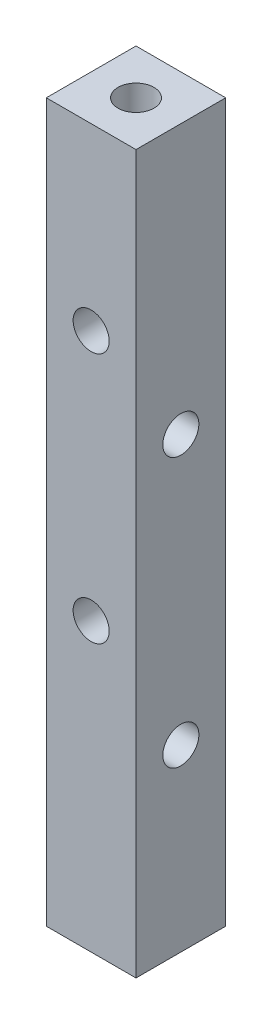
ISO-10303-21;
HEADER;
FILE_DESCRIPTION(('STEP AP214'),'2;1');
FILE_NAME('part.step','',(''),(''),'','','');
FILE_SCHEMA(('AUTOMOTIVE_DESIGN { 1 0 10303 214 1 1 1 1 }'));
ENDSEC;
DATA;
#1=APPLICATION_CONTEXT('core data for automotive mechanical design processes');
#2=APPLICATION_PROTOCOL_DEFINITION('international standard','automotive_design',2000,#1);
#3=PRODUCT_CONTEXT('',#1,'mechanical');
#4=PRODUCT('Part','Part','',(#3));
#5=PRODUCT_RELATED_PRODUCT_CATEGORY('part','',(#4));
#6=PRODUCT_DEFINITION_FORMATION('','',#4);
#7=PRODUCT_DEFINITION_CONTEXT('part definition',#1,'design');
#8=PRODUCT_DEFINITION('design','',#6,#7);
#9=PRODUCT_DEFINITION_SHAPE('','',#8);
#10=(LENGTH_UNIT() NAMED_UNIT(*) SI_UNIT(.MILLI.,.METRE.));
#11=(NAMED_UNIT(*) PLANE_ANGLE_UNIT() SI_UNIT($,.RADIAN.));
#12=(NAMED_UNIT(*) SI_UNIT($,.STERADIAN.) SOLID_ANGLE_UNIT());
#13=UNCERTAINTY_MEASURE_WITH_UNIT(LENGTH_MEASURE(1.E-05),#10,'distance_accuracy_value','');
#14=(GEOMETRIC_REPRESENTATION_CONTEXT(3) GLOBAL_UNCERTAINTY_ASSIGNED_CONTEXT((#13)) GLOBAL_UNIT_ASSIGNED_CONTEXT((#10,
#11,#12)) REPRESENTATION_CONTEXT('',''));
#15=CARTESIAN_POINT('',(0.,0.,0.));
#16=DIRECTION('',(0.,0.,1.));
#17=DIRECTION('',(1.,0.,0.));
#18=AXIS2_PLACEMENT_3D('',#15,#16,#17);
#19=CARTESIAN_POINT('',(0.,101.6,0.));
#20=DIRECTION('',(1.,0.,0.));
#21=DIRECTION('',(0.,0.,-1.));
#22=AXIS2_PLACEMENT_3D('',#19,#20,#21);
#23=PLANE('',#22);
#24=CARTESIAN_POINT('',(0.,25.4,6.35));
#25=DIRECTION('',(1.,0.,0.));
#26=DIRECTION('',(0.,0.,-1.));
#27=AXIS2_PLACEMENT_3D('',#24,#25,#26);
#28=CIRCLE('',#27,2.55269999999999);
#29=CARTESIAN_POINT('',(0.,25.4,3.79730000000002));
#30=VERTEX_POINT('',#29);
#31=EDGE_CURVE('E164',#30,#30,#28,.T.);
#32=ORIENTED_EDGE('',*,*,#31,.T.);
#33=EDGE_LOOP('',(#32));
#34=FACE_BOUND('',#33,.T.);
#35=CARTESIAN_POINT('',(0.,63.5,6.35));
#36=DIRECTION('',(1.,0.,0.));
#37=DIRECTION('',(0.,0.,-1.));
#38=AXIS2_PLACEMENT_3D('',#35,#36,#37);
#39=CIRCLE('',#38,2.55269999999999);
#40=CARTESIAN_POINT('',(0.,63.5,3.79730000000001));
#41=VERTEX_POINT('',#40);
#42=EDGE_CURVE('E167',#41,#41,#39,.T.);
#43=ORIENTED_EDGE('',*,*,#42,.T.);
#44=EDGE_LOOP('',(#43));
#45=FACE_BOUND('',#44,.T.);
#46=DIRECTION('',(0.,0.,1.));
#47=VECTOR('',#46,1.);
#48=CARTESIAN_POINT('',(0.,0.,0.));
#49=LINE('',#48,#47);
#50=CARTESIAN_POINT('',(0.,0.,0.));
#51=VERTEX_POINT('',#50);
#52=CARTESIAN_POINT('',(0.,0.,12.7));
#53=VERTEX_POINT('',#52);
#54=EDGE_CURVE('E114',#51,#53,#49,.T.);
#55=ORIENTED_EDGE('',*,*,#54,.T.);
#56=DIRECTION('',(0.,-1.,0.));
#57=VECTOR('',#56,1.);
#58=CARTESIAN_POINT('',(0.,101.6,12.7));
#59=LINE('',#58,#57);
#60=CARTESIAN_POINT('',(0.,101.6,12.7));
#61=VERTEX_POINT('',#60);
#62=EDGE_CURVE('E11',#61,#53,#59,.T.);
#63=ORIENTED_EDGE('',*,*,#62,.F.);
#64=DIRECTION('',(0.,0.,1.));
#65=VECTOR('',#64,1.);
#66=CARTESIAN_POINT('',(0.,101.6,0.));
#67=LINE('',#66,#65);
#68=CARTESIAN_POINT('',(0.,101.6,0.));
#69=VERTEX_POINT('',#68);
#70=EDGE_CURVE('E115',#69,#61,#67,.T.);
#71=ORIENTED_EDGE('',*,*,#70,.F.);
#72=DIRECTION('',(0.,-1.,0.));
#73=VECTOR('',#72,1.);
#74=CARTESIAN_POINT('',(0.,101.6,0.));
#75=LINE('',#74,#73);
#76=EDGE_CURVE('E121',#69,#51,#75,.T.);
#77=ORIENTED_EDGE('',*,*,#76,.T.);
#78=EDGE_LOOP('',(#55,#63,#71,#77));
#79=FACE_BOUND('',#78,.T.);
#80=ADVANCED_FACE('F37',(#34,#45,#79),#23,.F.);
#81=CARTESIAN_POINT('',(0.,101.6,12.7));
#82=DIRECTION('',(0.,0.,-1.));
#83=DIRECTION('',(-1.,0.,0.));
#84=AXIS2_PLACEMENT_3D('',#81,#82,#83);
#85=PLANE('',#84);
#86=CARTESIAN_POINT('',(6.35,76.2,12.7));
#87=DIRECTION('',(0.,0.,-1.));
#88=DIRECTION('',(-1.,0.,0.));
#89=AXIS2_PLACEMENT_3D('',#86,#87,#88);
#90=CIRCLE('',#89,2.55269999999999);
#91=CARTESIAN_POINT('',(3.79730000000001,76.2,12.7));
#92=VERTEX_POINT('',#91);
#93=EDGE_CURVE('E173',#92,#92,#90,.T.);
#94=ORIENTED_EDGE('',*,*,#93,.T.);
#95=EDGE_LOOP('',(#94));
#96=FACE_BOUND('',#95,.T.);
#97=CARTESIAN_POINT('',(6.35,40.64,12.7));
#98=DIRECTION('',(0.,0.,-1.));
#99=DIRECTION('',(-1.,0.,0.));
#100=AXIS2_PLACEMENT_3D('',#97,#98,#99);
#101=CIRCLE('',#100,2.55269999999999);
#102=CARTESIAN_POINT('',(3.79730000000001,40.64,12.7));
#103=VERTEX_POINT('',#102);
#104=EDGE_CURVE('E108',#103,#103,#101,.T.);
#105=ORIENTED_EDGE('',*,*,#104,.T.);
#106=EDGE_LOOP('',(#105));
#107=FACE_BOUND('',#106,.T.);
#108=DIRECTION('',(1.,0.,0.));
#109=VECTOR('',#108,1.);
#110=CARTESIAN_POINT('',(0.,0.,12.7));
#111=LINE('',#110,#109);
#112=CARTESIAN_POINT('',(12.7,0.,12.7));
#113=VERTEX_POINT('',#112);
#114=EDGE_CURVE('E124',#53,#113,#111,.T.);
#115=ORIENTED_EDGE('',*,*,#114,.T.);
#116=DIRECTION('',(0.,-1.,0.));
#117=VECTOR('',#116,1.);
#118=CARTESIAN_POINT('',(12.7,101.6,12.7));
#119=LINE('',#118,#117);
#120=CARTESIAN_POINT('',(12.7,101.6,12.7));
#121=VERTEX_POINT('',#120);
#122=EDGE_CURVE('E45',#121,#113,#119,.T.);
#123=ORIENTED_EDGE('',*,*,#122,.F.);
#124=DIRECTION('',(1.,0.,0.));
#125=VECTOR('',#124,1.);
#126=CARTESIAN_POINT('',(0.,101.6,12.7));
#127=LINE('',#126,#125);
#128=EDGE_CURVE('E84',#61,#121,#127,.T.);
#129=ORIENTED_EDGE('',*,*,#128,.F.);
#130=ORIENTED_EDGE('',*,*,#62,.T.);
#131=EDGE_LOOP('',(#115,#123,#129,#130));
#132=FACE_BOUND('',#131,.T.);
#133=ADVANCED_FACE('F149',(#96,#107,#132),#85,.F.);
#134=CARTESIAN_POINT('',(12.7,101.6,0.));
#135=DIRECTION('',(-1.,0.,0.));
#136=DIRECTION('',(0.,0.,1.));
#137=AXIS2_PLACEMENT_3D('',#134,#135,#136);
#138=PLANE('',#137);
#139=CARTESIAN_POINT('',(12.7,25.4,6.35));
#140=DIRECTION('',(1.,0.,0.));
#141=DIRECTION('',(0.,0.,-1.));
#142=AXIS2_PLACEMENT_3D('',#139,#140,#141);
#143=CIRCLE('',#142,2.55269999999999);
#144=CARTESIAN_POINT('',(12.7,25.4,3.79730000000001));
#145=VERTEX_POINT('',#144);
#146=EDGE_CURVE('E317',#145,#145,#143,.T.);
#147=ORIENTED_EDGE('',*,*,#146,.F.);
#148=EDGE_LOOP('',(#147));
#149=FACE_BOUND('',#148,.T.);
#150=CARTESIAN_POINT('',(12.7,63.5,6.35));
#151=DIRECTION('',(1.,0.,0.));
#152=DIRECTION('',(0.,0.,-1.));
#153=AXIS2_PLACEMENT_3D('',#150,#151,#152);
#154=CIRCLE('',#153,2.55269999999999);
#155=CARTESIAN_POINT('',(12.7,63.5,3.79730000000001));
#156=VERTEX_POINT('',#155);
#157=EDGE_CURVE('E170',#156,#156,#154,.T.);
#158=ORIENTED_EDGE('',*,*,#157,.F.);
#159=EDGE_LOOP('',(#158));
#160=FACE_BOUND('',#159,.T.);
#161=DIRECTION('',(0.,0.,-1.));
#162=VECTOR('',#161,1.);
#163=CARTESIAN_POINT('',(12.7,0.,0.));
#164=LINE('',#163,#162);
#165=CARTESIAN_POINT('',(12.7,0.,0.));
#166=VERTEX_POINT('',#165);
#167=EDGE_CURVE('E71',#113,#166,#164,.T.);
#168=ORIENTED_EDGE('',*,*,#167,.T.);
#169=DIRECTION('',(0.,-1.,0.));
#170=VECTOR('',#169,1.);
#171=CARTESIAN_POINT('',(12.7,101.6,0.));
#172=LINE('',#171,#170);
#173=CARTESIAN_POINT('',(12.7,101.6,0.));
#174=VERTEX_POINT('',#173);
#175=EDGE_CURVE('E129',#174,#166,#172,.T.);
#176=ORIENTED_EDGE('',*,*,#175,.F.);
#177=DIRECTION('',(0.,0.,-1.));
#178=VECTOR('',#177,1.);
#179=CARTESIAN_POINT('',(12.7,101.6,0.));
#180=LINE('',#179,#178);
#181=EDGE_CURVE('E118',#121,#174,#180,.T.);
#182=ORIENTED_EDGE('',*,*,#181,.F.);
#183=ORIENTED_EDGE('',*,*,#122,.T.);
#184=EDGE_LOOP('',(#168,#176,#182,#183));
#185=FACE_BOUND('',#184,.T.);
#186=ADVANCED_FACE('F131',(#149,#160,#185),#138,.F.);
#187=CARTESIAN_POINT('',(0.,101.6,0.));
#188=DIRECTION('',(0.,0.,1.));
#189=DIRECTION('',(1.,0.,0.));
#190=AXIS2_PLACEMENT_3D('',#187,#188,#189);
#191=PLANE('',#190);
#192=CARTESIAN_POINT('',(6.35,76.2,0.));
#193=DIRECTION('',(0.,0.,-1.));
#194=DIRECTION('',(-1.,0.,0.));
#195=AXIS2_PLACEMENT_3D('',#192,#193,#194);
#196=CIRCLE('',#195,2.55269999999999);
#197=CARTESIAN_POINT('',(3.79730000000001,76.2,0.));
#198=VERTEX_POINT('',#197);
#199=EDGE_CURVE('E169',#198,#198,#196,.T.);
#200=ORIENTED_EDGE('',*,*,#199,.F.);
#201=EDGE_LOOP('',(#200));
#202=FACE_BOUND('',#201,.T.);
#203=CARTESIAN_POINT('',(6.35,40.64,0.));
#204=DIRECTION('',(0.,0.,-1.));
#205=DIRECTION('',(-1.,0.,0.));
#206=AXIS2_PLACEMENT_3D('',#203,#204,#205);
#207=CIRCLE('',#206,2.55269999999999);
#208=CARTESIAN_POINT('',(3.79730000000001,40.64,0.));
#209=VERTEX_POINT('',#208);
#210=EDGE_CURVE('E181',#209,#209,#207,.T.);
#211=ORIENTED_EDGE('',*,*,#210,.F.);
#212=EDGE_LOOP('',(#211));
#213=FACE_BOUND('',#212,.T.);
#214=DIRECTION('',(-1.,0.,0.));
#215=VECTOR('',#214,1.);
#216=CARTESIAN_POINT('',(0.,0.,0.));
#217=LINE('',#216,#215);
#218=EDGE_CURVE('E77',#166,#51,#217,.T.);
#219=ORIENTED_EDGE('',*,*,#218,.T.);
#220=ORIENTED_EDGE('',*,*,#76,.F.);
#221=DIRECTION('',(-1.,0.,0.));
#222=VECTOR('',#221,1.);
#223=CARTESIAN_POINT('',(0.,101.6,0.));
#224=LINE('',#223,#222);
#225=EDGE_CURVE('E53',#174,#69,#224,.T.);
#226=ORIENTED_EDGE('',*,*,#225,.F.);
#227=ORIENTED_EDGE('',*,*,#175,.T.);
#228=EDGE_LOOP('',(#219,#220,#226,#227));
#229=FACE_BOUND('',#228,.T.);
#230=ADVANCED_FACE('F138',(#202,#213,#229),#191,.F.);
#231=CARTESIAN_POINT('',(0.,101.6,0.));
#232=DIRECTION('',(0.,1.,0.));
#233=DIRECTION('',(0.,0.,1.));
#234=AXIS2_PLACEMENT_3D('',#231,#232,#233);
#235=PLANE('',#234);
#236=CARTESIAN_POINT('',(6.35,101.6,6.35));
#237=DIRECTION('',(0.,1.,0.));
#238=DIRECTION('',(0.,0.,1.));
#239=AXIS2_PLACEMENT_3D('',#236,#237,#238);
#240=CIRCLE('',#239,2.55269999999999);
#241=CARTESIAN_POINT('',(6.35,101.6,8.90269999999999));
#242=VERTEX_POINT('',#241);
#243=EDGE_CURVE('E101',#242,#242,#240,.T.);
#244=ORIENTED_EDGE('',*,*,#243,.F.);
#245=EDGE_LOOP('',(#244));
#246=FACE_BOUND('',#245,.T.);
#247=ORIENTED_EDGE('',*,*,#70,.T.);
#248=ORIENTED_EDGE('',*,*,#128,.T.);
#249=ORIENTED_EDGE('',*,*,#181,.T.);
#250=ORIENTED_EDGE('',*,*,#225,.T.);
#251=EDGE_LOOP('',(#247,#248,#249,#250));
#252=FACE_BOUND('',#251,.T.);
#253=ADVANCED_FACE('F140',(#246,#252),#235,.T.);
#254=CARTESIAN_POINT('',(0.,0.,0.));
#255=DIRECTION('',(0.,1.,0.));
#256=DIRECTION('',(0.,0.,1.));
#257=AXIS2_PLACEMENT_3D('',#254,#255,#256);
#258=PLANE('',#257);
#259=CARTESIAN_POINT('',(6.35,0.,6.35));
#260=DIRECTION('',(0.,-1.,0.));
#261=DIRECTION('',(0.,0.,-1.));
#262=AXIS2_PLACEMENT_3D('',#259,#260,#261);
#263=CIRCLE('',#262,2.55269999999999);
#264=CARTESIAN_POINT('',(6.35,0.,3.79730000000001));
#265=VERTEX_POINT('',#264);
#266=EDGE_CURVE('E102',#265,#265,#263,.T.);
#267=ORIENTED_EDGE('',*,*,#266,.F.);
#268=EDGE_LOOP('',(#267));
#269=FACE_BOUND('',#268,.T.);
#270=ORIENTED_EDGE('',*,*,#54,.F.);
#271=ORIENTED_EDGE('',*,*,#218,.F.);
#272=ORIENTED_EDGE('',*,*,#167,.F.);
#273=ORIENTED_EDGE('',*,*,#114,.F.);
#274=EDGE_LOOP('',(#270,#271,#272,#273));
#275=FACE_BOUND('',#274,.T.);
#276=ADVANCED_FACE('F134',(#269,#275),#258,.F.);
#277=CARTESIAN_POINT('',(6.35,85.09,6.35));
#278=DIRECTION('',(0.,1.,0.));
#279=DIRECTION('',(0.,0.,1.));
#280=AXIS2_PLACEMENT_3D('',#277,#278,#279);
#281=CONICAL_SURFACE('',#280,2.55269999999999,1.02974425867665);
#282=CARTESIAN_POINT('',(6.35,83.5561830978084,6.35));
#283=VERTEX_POINT('',#282);
#284=VERTEX_LOOP('',#283);
#285=FACE_BOUND('',#284,.T.);
#286=CARTESIAN_POINT('',(6.35,85.09,6.35));
#287=DIRECTION('',(0.,1.,0.));
#288=DIRECTION('',(0.,0.,1.));
#289=AXIS2_PLACEMENT_3D('',#286,#287,#288);
#290=CIRCLE('',#289,2.55269999999999);
#291=CARTESIAN_POINT('',(6.35,85.09,8.90269999999999));
#292=VERTEX_POINT('',#291);
#293=EDGE_CURVE('E105',#292,#292,#290,.T.);
#294=ORIENTED_EDGE('',*,*,#293,.T.);
#295=EDGE_LOOP('',(#294));
#296=FACE_BOUND('',#295,.T.);
#297=ADVANCED_FACE('F204',(#285,#296),#281,.F.);
#298=CARTESIAN_POINT('',(6.35,101.6,6.35));
#299=DIRECTION('',(0.,1.,0.));
#300=DIRECTION('',(0.,0.,1.));
#301=AXIS2_PLACEMENT_3D('',#298,#299,#300);
#302=CYLINDRICAL_SURFACE('',#301,2.55269999999999);
#303=ORIENTED_EDGE('',*,*,#293,.F.);
#304=EDGE_LOOP('',(#303));
#305=FACE_BOUND('',#304,.T.);
#306=ORIENTED_EDGE('',*,*,#243,.T.);
#307=EDGE_LOOP('',(#306));
#308=FACE_BOUND('',#307,.T.);
#309=ADVANCED_FACE('F95',(#305,#308),#302,.F.);
#310=CARTESIAN_POINT('',(6.35,16.51,6.35));
#311=DIRECTION('',(0.,-1.,0.));
#312=DIRECTION('',(0.,0.,-1.));
#313=AXIS2_PLACEMENT_3D('',#310,#311,#312);
#314=CONICAL_SURFACE('',#313,2.55269999999999,1.02974425867665);
#315=CARTESIAN_POINT('',(6.35,18.0438169021916,6.35));
#316=VERTEX_POINT('',#315);
#317=VERTEX_LOOP('',#316);
#318=FACE_BOUND('',#317,.T.);
#319=CARTESIAN_POINT('',(6.35,16.51,6.35));
#320=DIRECTION('',(0.,-1.,0.));
#321=DIRECTION('',(0.,0.,-1.));
#322=AXIS2_PLACEMENT_3D('',#319,#320,#321);
#323=CIRCLE('',#322,2.55269999999999);
#324=CARTESIAN_POINT('',(6.35,16.51,3.79730000000001));
#325=VERTEX_POINT('',#324);
#326=EDGE_CURVE('E99',#325,#325,#323,.T.);
#327=ORIENTED_EDGE('',*,*,#326,.T.);
#328=EDGE_LOOP('',(#327));
#329=FACE_BOUND('',#328,.T.);
#330=ADVANCED_FACE('F91',(#318,#329),#314,.F.);
#331=CARTESIAN_POINT('',(6.35,0.,6.35));
#332=DIRECTION('',(0.,-1.,0.));
#333=DIRECTION('',(0.,0.,-1.));
#334=AXIS2_PLACEMENT_3D('',#331,#332,#333);
#335=CYLINDRICAL_SURFACE('',#334,2.55269999999999);
#336=ORIENTED_EDGE('',*,*,#326,.F.);
#337=EDGE_LOOP('',(#336));
#338=FACE_BOUND('',#337,.T.);
#339=ORIENTED_EDGE('',*,*,#266,.T.);
#340=EDGE_LOOP('',(#339));
#341=FACE_BOUND('',#340,.T.);
#342=ADVANCED_FACE('F94',(#338,#341),#335,.F.);
#343=CARTESIAN_POINT('',(6.35,40.64,0.));
#344=DIRECTION('',(0.,0.,-1.));
#345=DIRECTION('',(-1.,0.,0.));
#346=AXIS2_PLACEMENT_3D('',#343,#344,#345);
#347=CYLINDRICAL_SURFACE('',#346,2.55269999999999);
#348=ORIENTED_EDGE('',*,*,#210,.T.);
#349=EDGE_LOOP('',(#348));
#350=FACE_BOUND('',#349,.T.);
#351=ORIENTED_EDGE('',*,*,#104,.F.);
#352=EDGE_LOOP('',(#351));
#353=FACE_BOUND('',#352,.T.);
#354=ADVANCED_FACE('F187',(#350,#353),#347,.F.);
#355=CARTESIAN_POINT('',(6.35,76.2,0.));
#356=DIRECTION('',(0.,0.,-1.));
#357=DIRECTION('',(-1.,0.,0.));
#358=AXIS2_PLACEMENT_3D('',#355,#356,#357);
#359=CYLINDRICAL_SURFACE('',#358,2.55269999999999);
#360=ORIENTED_EDGE('',*,*,#199,.T.);
#361=EDGE_LOOP('',(#360));
#362=FACE_BOUND('',#361,.T.);
#363=ORIENTED_EDGE('',*,*,#93,.F.);
#364=EDGE_LOOP('',(#363));
#365=FACE_BOUND('',#364,.T.);
#366=ADVANCED_FACE('F189',(#362,#365),#359,.F.);
#367=CARTESIAN_POINT('',(12.7,63.5,6.35));
#368=DIRECTION('',(1.,0.,0.));
#369=DIRECTION('',(0.,0.,-1.));
#370=AXIS2_PLACEMENT_3D('',#367,#368,#369);
#371=CYLINDRICAL_SURFACE('',#370,2.55269999999999);
#372=ORIENTED_EDGE('',*,*,#157,.T.);
#373=EDGE_LOOP('',(#372));
#374=FACE_BOUND('',#373,.T.);
#375=ORIENTED_EDGE('',*,*,#42,.F.);
#376=EDGE_LOOP('',(#375));
#377=FACE_BOUND('',#376,.T.);
#378=ADVANCED_FACE('F196',(#374,#377),#371,.F.);
#379=CARTESIAN_POINT('',(12.7,25.4,6.35));
#380=DIRECTION('',(1.,0.,0.));
#381=DIRECTION('',(0.,0.,-1.));
#382=AXIS2_PLACEMENT_3D('',#379,#380,#381);
#383=CYLINDRICAL_SURFACE('',#382,2.55269999999999);
#384=ORIENTED_EDGE('',*,*,#146,.T.);
#385=EDGE_LOOP('',(#384));
#386=FACE_BOUND('',#385,.T.);
#387=ORIENTED_EDGE('',*,*,#31,.F.);
#388=EDGE_LOOP('',(#387));
#389=FACE_BOUND('',#388,.T.);
#390=ADVANCED_FACE('F255',(#386,#389),#383,.F.);
#391=CLOSED_SHELL('',(#80,#133,#186,#230,#253,#276,#297,#309,#330,#342,#354,#366,#378,#390));
#392=MANIFOLD_SOLID_BREP('B2',#391);
#393=ADVANCED_BREP_SHAPE_REPRESENTATION('',(#18,#392),#14);
#394=SHAPE_DEFINITION_REPRESENTATION(#9,#393);
ENDSEC;
END-ISO-10303-21;
